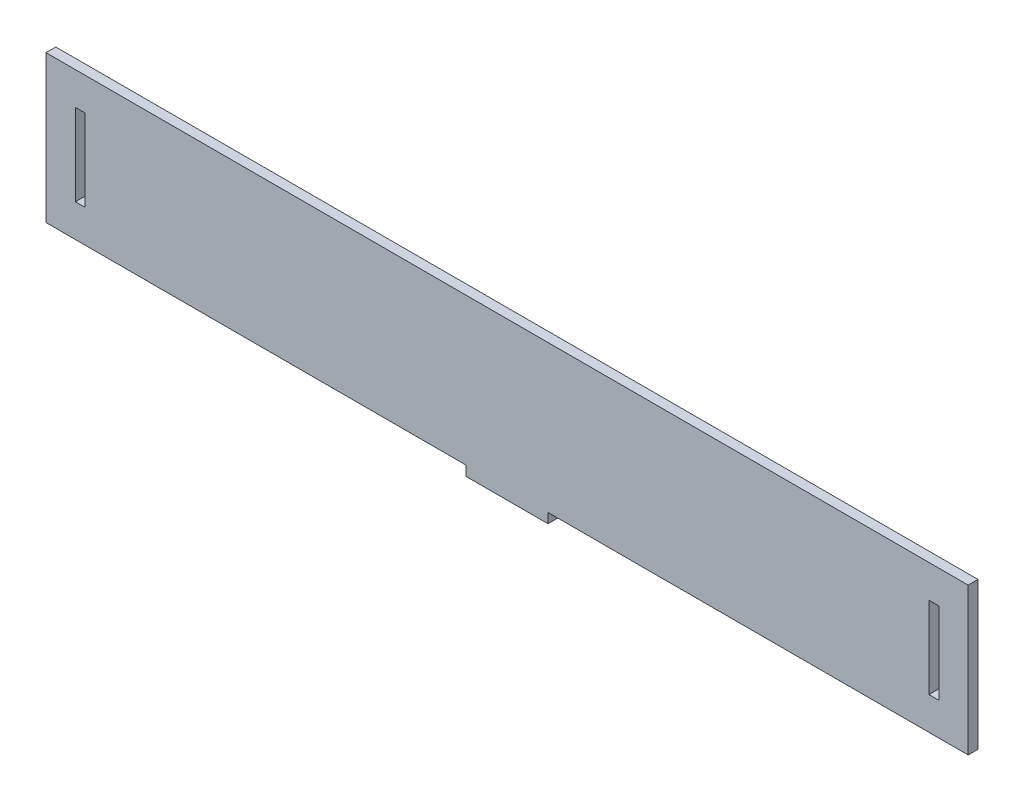
ISO-10303-21;
HEADER;
FILE_DESCRIPTION(('STEP AP214'),'2;1');
FILE_NAME('part.step','',(''),(''),'','','');
FILE_SCHEMA(('AUTOMOTIVE_DESIGN { 1 0 10303 214 1 1 1 1 }'));
ENDSEC;
DATA;
#1=APPLICATION_CONTEXT('core data for automotive mechanical design processes');
#2=APPLICATION_PROTOCOL_DEFINITION('international standard','automotive_design',2000,#1);
#3=PRODUCT_CONTEXT('',#1,'mechanical');
#4=PRODUCT('Part','Part','',(#3));
#5=PRODUCT_RELATED_PRODUCT_CATEGORY('part','',(#4));
#6=PRODUCT_DEFINITION_FORMATION('','',#4);
#7=PRODUCT_DEFINITION_CONTEXT('part definition',#1,'design');
#8=PRODUCT_DEFINITION('design','',#6,#7);
#9=PRODUCT_DEFINITION_SHAPE('','',#8);
#10=(LENGTH_UNIT() NAMED_UNIT(*) SI_UNIT(.MILLI.,.METRE.));
#11=(NAMED_UNIT(*) PLANE_ANGLE_UNIT() SI_UNIT($,.RADIAN.));
#12=(NAMED_UNIT(*) SI_UNIT($,.STERADIAN.) SOLID_ANGLE_UNIT());
#13=UNCERTAINTY_MEASURE_WITH_UNIT(LENGTH_MEASURE(1.E-05),#10,'distance_accuracy_value','');
#14=(GEOMETRIC_REPRESENTATION_CONTEXT(3) GLOBAL_UNCERTAINTY_ASSIGNED_CONTEXT((#13)) GLOBAL_UNIT_ASSIGNED_CONTEXT((#10,
#11,#12)) REPRESENTATION_CONTEXT('',''));
#15=CARTESIAN_POINT('',(0.,0.,0.));
#16=DIRECTION('',(0.,0.,1.));
#17=DIRECTION('',(1.,0.,0.));
#18=AXIS2_PLACEMENT_3D('',#15,#16,#17);
#19=CARTESIAN_POINT('',(0.,0.,6.));
#20=DIRECTION('',(0.,0.,1.));
#21=DIRECTION('',(1.,0.,0.));
#22=AXIS2_PLACEMENT_3D('',#19,#20,#21);
#23=PLANE('',#22);
#24=DIRECTION('',(0.,-1.,0.));
#25=VECTOR('',#24,1.);
#26=CARTESIAN_POINT('',(0.,0.,6.));
#27=LINE('',#26,#25);
#28=CARTESIAN_POINT('',(0.,0.,6.));
#29=VERTEX_POINT('',#28);
#30=CARTESIAN_POINT('',(0.,-90.,6.));
#31=VERTEX_POINT('',#30);
#32=EDGE_CURVE('E215',#29,#31,#27,.T.);
#33=ORIENTED_EDGE('',*,*,#32,.T.);
#34=DIRECTION('',(1.,0.,0.));
#35=VECTOR('',#34,1.);
#36=CARTESIAN_POINT('',(0.,-90.,6.));
#37=LINE('',#36,#35);
#38=CARTESIAN_POINT('',(257.,-90.,6.));
#39=VERTEX_POINT('',#38);
#40=EDGE_CURVE('E218',#31,#39,#37,.T.);
#41=ORIENTED_EDGE('',*,*,#40,.T.);
#42=DIRECTION('',(0.,-1.,0.));
#43=VECTOR('',#42,1.);
#44=CARTESIAN_POINT('',(257.,-90.,6.));
#45=LINE('',#44,#43);
#46=CARTESIAN_POINT('',(257.,-95.9999999999999,6.));
#47=VERTEX_POINT('',#46);
#48=EDGE_CURVE('E221',#39,#47,#45,.T.);
#49=ORIENTED_EDGE('',*,*,#48,.T.);
#50=DIRECTION('',(1.,0.,0.));
#51=VECTOR('',#50,1.);
#52=CARTESIAN_POINT('',(257.,-95.9999999999999,6.));
#53=LINE('',#52,#51);
#54=CARTESIAN_POINT('',(307.,-95.9999999999999,6.));
#55=VERTEX_POINT('',#54);
#56=EDGE_CURVE('E223',#47,#55,#53,.T.);
#57=ORIENTED_EDGE('',*,*,#56,.T.);
#58=DIRECTION('',(0.,1.,0.));
#59=VECTOR('',#58,1.);
#60=CARTESIAN_POINT('',(307.,-90.,6.));
#61=LINE('',#60,#59);
#62=CARTESIAN_POINT('',(307.,-90.,6.));
#63=VERTEX_POINT('',#62);
#64=EDGE_CURVE('E225',#55,#63,#61,.T.);
#65=ORIENTED_EDGE('',*,*,#64,.T.);
#66=DIRECTION('',(1.,0.,0.));
#67=VECTOR('',#66,1.);
#68=CARTESIAN_POINT('',(307.,-90.,6.));
#69=LINE('',#68,#67);
#70=CARTESIAN_POINT('',(564.,-90.,6.));
#71=VERTEX_POINT('',#70);
#72=EDGE_CURVE('E227',#63,#71,#69,.T.);
#73=ORIENTED_EDGE('',*,*,#72,.T.);
#74=DIRECTION('',(0.,1.,0.));
#75=VECTOR('',#74,1.);
#76=CARTESIAN_POINT('',(564.,0.,6.));
#77=LINE('',#76,#75);
#78=CARTESIAN_POINT('',(564.,0.,6.));
#79=VERTEX_POINT('',#78);
#80=EDGE_CURVE('E229',#71,#79,#77,.T.);
#81=ORIENTED_EDGE('',*,*,#80,.T.);
#82=DIRECTION('',(-1.,0.,0.));
#83=VECTOR('',#82,1.);
#84=CARTESIAN_POINT('',(0.,0.,6.));
#85=LINE('',#84,#83);
#86=EDGE_CURVE('E231',#79,#29,#85,.T.);
#87=ORIENTED_EDGE('',*,*,#86,.T.);
#88=EDGE_LOOP('',(#33,#41,#49,#57,#65,#73,#81,#87));
#89=FACE_BOUND('',#88,.T.);
#90=DIRECTION('',(-1.,0.,0.));
#91=VECTOR('',#90,1.);
#92=CARTESIAN_POINT('',(18.,-20.,6.));
#93=LINE('',#92,#91);
#94=CARTESIAN_POINT('',(24.,-20.,6.));
#95=VERTEX_POINT('',#94);
#96=CARTESIAN_POINT('',(18.,-20.,6.));
#97=VERTEX_POINT('',#96);
#98=EDGE_CURVE('E186',#95,#97,#93,.T.);
#99=ORIENTED_EDGE('',*,*,#98,.F.);
#100=DIRECTION('',(0.,1.,0.));
#101=VECTOR('',#100,1.);
#102=CARTESIAN_POINT('',(24.,-20.,6.));
#103=LINE('',#102,#101);
#104=CARTESIAN_POINT('',(24.,-70.,6.));
#105=VERTEX_POINT('',#104);
#106=EDGE_CURVE('E184',#105,#95,#103,.T.);
#107=ORIENTED_EDGE('',*,*,#106,.F.);
#108=DIRECTION('',(1.,0.,0.));
#109=VECTOR('',#108,1.);
#110=CARTESIAN_POINT('',(18.,-70.,6.));
#111=LINE('',#110,#109);
#112=CARTESIAN_POINT('',(18.,-70.,6.));
#113=VERTEX_POINT('',#112);
#114=EDGE_CURVE('E192',#113,#105,#111,.T.);
#115=ORIENTED_EDGE('',*,*,#114,.F.);
#116=DIRECTION('',(0.,-1.,0.));
#117=VECTOR('',#116,1.);
#118=CARTESIAN_POINT('',(18.,-20.,6.));
#119=LINE('',#118,#117);
#120=EDGE_CURVE('E189',#97,#113,#119,.T.);
#121=ORIENTED_EDGE('',*,*,#120,.F.);
#122=EDGE_LOOP('',(#99,#107,#115,#121));
#123=FACE_BOUND('',#122,.T.);
#124=DIRECTION('',(-1.,0.,0.));
#125=VECTOR('',#124,1.);
#126=CARTESIAN_POINT('',(546.,-20.,6.));
#127=LINE('',#126,#125);
#128=CARTESIAN_POINT('',(546.,-20.,6.));
#129=VERTEX_POINT('',#128);
#130=CARTESIAN_POINT('',(540.,-20.,6.));
#131=VERTEX_POINT('',#130);
#132=EDGE_CURVE('E156',#129,#131,#127,.T.);
#133=ORIENTED_EDGE('',*,*,#132,.F.);
#134=DIRECTION('',(0.,1.,0.));
#135=VECTOR('',#134,1.);
#136=CARTESIAN_POINT('',(546.,-20.,6.));
#137=LINE('',#136,#135);
#138=CARTESIAN_POINT('',(546.,-70.,6.));
#139=VERTEX_POINT('',#138);
#140=EDGE_CURVE('E148',#139,#129,#137,.T.);
#141=ORIENTED_EDGE('',*,*,#140,.F.);
#142=DIRECTION('',(1.,0.,0.));
#143=VECTOR('',#142,1.);
#144=CARTESIAN_POINT('',(546.,-70.,6.));
#145=LINE('',#144,#143);
#146=CARTESIAN_POINT('',(540.,-70.,6.));
#147=VERTEX_POINT('',#146);
#148=EDGE_CURVE('E170',#147,#139,#145,.T.);
#149=ORIENTED_EDGE('',*,*,#148,.F.);
#150=DIRECTION('',(0.,-1.,0.));
#151=VECTOR('',#150,1.);
#152=CARTESIAN_POINT('',(540.,-20.,6.));
#153=LINE('',#152,#151);
#154=EDGE_CURVE('E168',#131,#147,#153,.T.);
#155=ORIENTED_EDGE('',*,*,#154,.F.);
#156=EDGE_LOOP('',(#133,#141,#149,#155));
#157=FACE_BOUND('',#156,.T.);
#158=ADVANCED_FACE('F35',(#89,#123,#157),#23,.T.);
#159=CARTESIAN_POINT('',(0.,0.,0.));
#160=DIRECTION('',(0.,0.,1.));
#161=DIRECTION('',(1.,0.,0.));
#162=AXIS2_PLACEMENT_3D('',#159,#160,#161);
#163=PLANE('',#162);
#164=DIRECTION('',(0.,1.,0.));
#165=VECTOR('',#164,1.);
#166=CARTESIAN_POINT('',(24.,-20.,0.));
#167=LINE('',#166,#165);
#168=CARTESIAN_POINT('',(24.,-70.,0.));
#169=VERTEX_POINT('',#168);
#170=CARTESIAN_POINT('',(24.,-20.,0.));
#171=VERTEX_POINT('',#170);
#172=EDGE_CURVE('E164',#169,#171,#167,.T.);
#173=ORIENTED_EDGE('',*,*,#172,.T.);
#174=DIRECTION('',(-1.,0.,0.));
#175=VECTOR('',#174,1.);
#176=CARTESIAN_POINT('',(18.,-20.,0.));
#177=LINE('',#176,#175);
#178=CARTESIAN_POINT('',(18.,-20.,0.));
#179=VERTEX_POINT('',#178);
#180=EDGE_CURVE('E197',#171,#179,#177,.T.);
#181=ORIENTED_EDGE('',*,*,#180,.T.);
#182=DIRECTION('',(0.,-1.,0.));
#183=VECTOR('',#182,1.);
#184=CARTESIAN_POINT('',(18.,-20.,0.));
#185=LINE('',#184,#183);
#186=CARTESIAN_POINT('',(18.,-70.,0.));
#187=VERTEX_POINT('',#186);
#188=EDGE_CURVE('E200',#179,#187,#185,.T.);
#189=ORIENTED_EDGE('',*,*,#188,.T.);
#190=DIRECTION('',(1.,0.,0.));
#191=VECTOR('',#190,1.);
#192=CARTESIAN_POINT('',(18.,-70.,0.));
#193=LINE('',#192,#191);
#194=EDGE_CURVE('E187',#187,#169,#193,.T.);
#195=ORIENTED_EDGE('',*,*,#194,.T.);
#196=EDGE_LOOP('',(#173,#181,#189,#195));
#197=FACE_BOUND('',#196,.T.);
#198=DIRECTION('',(0.,-1.,0.));
#199=VECTOR('',#198,1.);
#200=CARTESIAN_POINT('',(0.,0.,0.));
#201=LINE('',#200,#199);
#202=CARTESIAN_POINT('',(0.,0.,0.));
#203=VERTEX_POINT('',#202);
#204=CARTESIAN_POINT('',(0.,-90.,0.));
#205=VERTEX_POINT('',#204);
#206=EDGE_CURVE('E214',#203,#205,#201,.T.);
#207=ORIENTED_EDGE('',*,*,#206,.F.);
#208=DIRECTION('',(-1.,0.,0.));
#209=VECTOR('',#208,1.);
#210=CARTESIAN_POINT('',(0.,0.,0.));
#211=LINE('',#210,#209);
#212=CARTESIAN_POINT('',(564.,0.,0.));
#213=VERTEX_POINT('',#212);
#214=EDGE_CURVE('E219',#213,#203,#211,.T.);
#215=ORIENTED_EDGE('',*,*,#214,.F.);
#216=DIRECTION('',(0.,1.,0.));
#217=VECTOR('',#216,1.);
#218=CARTESIAN_POINT('',(564.,0.,0.));
#219=LINE('',#218,#217);
#220=CARTESIAN_POINT('',(564.,-90.,0.));
#221=VERTEX_POINT('',#220);
#222=EDGE_CURVE('E246',#221,#213,#219,.T.);
#223=ORIENTED_EDGE('',*,*,#222,.F.);
#224=DIRECTION('',(1.,0.,0.));
#225=VECTOR('',#224,1.);
#226=CARTESIAN_POINT('',(307.,-90.,0.));
#227=LINE('',#226,#225);
#228=CARTESIAN_POINT('',(307.,-90.,0.));
#229=VERTEX_POINT('',#228);
#230=EDGE_CURVE('E244',#229,#221,#227,.T.);
#231=ORIENTED_EDGE('',*,*,#230,.F.);
#232=DIRECTION('',(0.,1.,0.));
#233=VECTOR('',#232,1.);
#234=CARTESIAN_POINT('',(307.,-90.,0.));
#235=LINE('',#234,#233);
#236=CARTESIAN_POINT('',(307.,-95.9999999999999,0.));
#237=VERTEX_POINT('',#236);
#238=EDGE_CURVE('E242',#237,#229,#235,.T.);
#239=ORIENTED_EDGE('',*,*,#238,.F.);
#240=DIRECTION('',(1.,0.,0.));
#241=VECTOR('',#240,1.);
#242=CARTESIAN_POINT('',(257.,-95.9999999999999,0.));
#243=LINE('',#242,#241);
#244=CARTESIAN_POINT('',(257.,-95.9999999999999,0.));
#245=VERTEX_POINT('',#244);
#246=EDGE_CURVE('E240',#245,#237,#243,.T.);
#247=ORIENTED_EDGE('',*,*,#246,.F.);
#248=DIRECTION('',(0.,-1.,0.));
#249=VECTOR('',#248,1.);
#250=CARTESIAN_POINT('',(257.,-90.,0.));
#251=LINE('',#250,#249);
#252=CARTESIAN_POINT('',(257.,-90.,0.));
#253=VERTEX_POINT('',#252);
#254=EDGE_CURVE('E238',#253,#245,#251,.T.);
#255=ORIENTED_EDGE('',*,*,#254,.F.);
#256=DIRECTION('',(1.,0.,0.));
#257=VECTOR('',#256,1.);
#258=CARTESIAN_POINT('',(0.,-90.,0.));
#259=LINE('',#258,#257);
#260=EDGE_CURVE('E236',#205,#253,#259,.T.);
#261=ORIENTED_EDGE('',*,*,#260,.F.);
#262=EDGE_LOOP('',(#207,#215,#223,#231,#239,#247,#255,#261));
#263=FACE_BOUND('',#262,.T.);
#264=DIRECTION('',(0.,1.,0.));
#265=VECTOR('',#264,1.);
#266=CARTESIAN_POINT('',(546.,-20.,0.));
#267=LINE('',#266,#265);
#268=CARTESIAN_POINT('',(546.,-70.,0.));
#269=VERTEX_POINT('',#268);
#270=CARTESIAN_POINT('',(546.,-20.,0.));
#271=VERTEX_POINT('',#270);
#272=EDGE_CURVE('E58',#269,#271,#267,.T.);
#273=ORIENTED_EDGE('',*,*,#272,.T.);
#274=DIRECTION('',(-1.,0.,0.));
#275=VECTOR('',#274,1.);
#276=CARTESIAN_POINT('',(546.,-20.,0.));
#277=LINE('',#276,#275);
#278=CARTESIAN_POINT('',(540.,-20.,0.));
#279=VERTEX_POINT('',#278);
#280=EDGE_CURVE('E163',#271,#279,#277,.T.);
#281=ORIENTED_EDGE('',*,*,#280,.T.);
#282=DIRECTION('',(0.,-1.,0.));
#283=VECTOR('',#282,1.);
#284=CARTESIAN_POINT('',(540.,-20.,0.));
#285=LINE('',#284,#283);
#286=CARTESIAN_POINT('',(540.,-70.,0.));
#287=VERTEX_POINT('',#286);
#288=EDGE_CURVE('E176',#279,#287,#285,.T.);
#289=ORIENTED_EDGE('',*,*,#288,.T.);
#290=DIRECTION('',(1.,0.,0.));
#291=VECTOR('',#290,1.);
#292=CARTESIAN_POINT('',(546.,-70.,0.));
#293=LINE('',#292,#291);
#294=EDGE_CURVE('E157',#287,#269,#293,.T.);
#295=ORIENTED_EDGE('',*,*,#294,.T.);
#296=EDGE_LOOP('',(#273,#281,#289,#295));
#297=FACE_BOUND('',#296,.T.);
#298=ADVANCED_FACE('F276',(#197,#263,#297),#163,.F.);
#299=CARTESIAN_POINT('',(0.,0.,6.));
#300=DIRECTION('',(1.,0.,0.));
#301=DIRECTION('',(0.,1.,0.));
#302=AXIS2_PLACEMENT_3D('',#299,#300,#301);
#303=PLANE('',#302);
#304=ORIENTED_EDGE('',*,*,#206,.T.);
#305=DIRECTION('',(0.,0.,-1.));
#306=VECTOR('',#305,1.);
#307=CARTESIAN_POINT('',(0.,-90.,6.));
#308=LINE('',#307,#306);
#309=EDGE_CURVE('E11',#31,#205,#308,.T.);
#310=ORIENTED_EDGE('',*,*,#309,.F.);
#311=ORIENTED_EDGE('',*,*,#32,.F.);
#312=DIRECTION('',(0.,0.,-1.));
#313=VECTOR('',#312,1.);
#314=CARTESIAN_POINT('',(0.,0.,6.));
#315=LINE('',#314,#313);
#316=EDGE_CURVE('E233',#29,#203,#315,.T.);
#317=ORIENTED_EDGE('',*,*,#316,.T.);
#318=EDGE_LOOP('',(#304,#310,#311,#317));
#319=FACE_BOUND('',#318,.T.);
#320=ADVANCED_FACE('F37',(#319),#303,.F.);
#321=CARTESIAN_POINT('',(0.,-90.,6.));
#322=DIRECTION('',(0.,1.,0.));
#323=DIRECTION('',(0.,0.,1.));
#324=AXIS2_PLACEMENT_3D('',#321,#322,#323);
#325=PLANE('',#324);
#326=ORIENTED_EDGE('',*,*,#260,.T.);
#327=DIRECTION('',(0.,0.,-1.));
#328=VECTOR('',#327,1.);
#329=CARTESIAN_POINT('',(257.,-90.,6.));
#330=LINE('',#329,#328);
#331=EDGE_CURVE('E43',#39,#253,#330,.T.);
#332=ORIENTED_EDGE('',*,*,#331,.F.);
#333=ORIENTED_EDGE('',*,*,#40,.F.);
#334=ORIENTED_EDGE('',*,*,#309,.T.);
#335=EDGE_LOOP('',(#326,#332,#333,#334));
#336=FACE_BOUND('',#335,.T.);
#337=ADVANCED_FACE('F294',(#336),#325,.F.);
#338=CARTESIAN_POINT('',(257.,-90.,6.));
#339=DIRECTION('',(1.,0.,0.));
#340=DIRECTION('',(0.,0.,-1.));
#341=AXIS2_PLACEMENT_3D('',#338,#339,#340);
#342=PLANE('',#341);
#343=ORIENTED_EDGE('',*,*,#254,.T.);
#344=DIRECTION('',(0.,0.,-1.));
#345=VECTOR('',#344,1.);
#346=CARTESIAN_POINT('',(257.,-95.9999999999999,6.));
#347=LINE('',#346,#345);
#348=EDGE_CURVE('E263',#47,#245,#347,.T.);
#349=ORIENTED_EDGE('',*,*,#348,.F.);
#350=ORIENTED_EDGE('',*,*,#48,.F.);
#351=ORIENTED_EDGE('',*,*,#331,.T.);
#352=EDGE_LOOP('',(#343,#349,#350,#351));
#353=FACE_BOUND('',#352,.T.);
#354=ADVANCED_FACE('F270',(#353),#342,.F.);
#355=CARTESIAN_POINT('',(257.,-95.9999999999999,6.));
#356=DIRECTION('',(0.,1.,0.));
#357=DIRECTION('',(0.,0.,1.));
#358=AXIS2_PLACEMENT_3D('',#355,#356,#357);
#359=PLANE('',#358);
#360=ORIENTED_EDGE('',*,*,#246,.T.);
#361=DIRECTION('',(0.,0.,-1.));
#362=VECTOR('',#361,1.);
#363=CARTESIAN_POINT('',(307.,-95.9999999999999,6.));
#364=LINE('',#363,#362);
#365=EDGE_CURVE('E260',#55,#237,#364,.T.);
#366=ORIENTED_EDGE('',*,*,#365,.F.);
#367=ORIENTED_EDGE('',*,*,#56,.F.);
#368=ORIENTED_EDGE('',*,*,#348,.T.);
#369=EDGE_LOOP('',(#360,#366,#367,#368));
#370=FACE_BOUND('',#369,.T.);
#371=ADVANCED_FACE('F282',(#370),#359,.F.);
#372=CARTESIAN_POINT('',(307.,-90.,6.));
#373=DIRECTION('',(-1.,0.,0.));
#374=DIRECTION('',(0.,0.,1.));
#375=AXIS2_PLACEMENT_3D('',#372,#373,#374);
#376=PLANE('',#375);
#377=ORIENTED_EDGE('',*,*,#238,.T.);
#378=DIRECTION('',(0.,0.,-1.));
#379=VECTOR('',#378,1.);
#380=CARTESIAN_POINT('',(307.,-90.,6.));
#381=LINE('',#380,#379);
#382=EDGE_CURVE('E257',#63,#229,#381,.T.);
#383=ORIENTED_EDGE('',*,*,#382,.F.);
#384=ORIENTED_EDGE('',*,*,#64,.F.);
#385=ORIENTED_EDGE('',*,*,#365,.T.);
#386=EDGE_LOOP('',(#377,#383,#384,#385));
#387=FACE_BOUND('',#386,.T.);
#388=ADVANCED_FACE('F286',(#387),#376,.F.);
#389=CARTESIAN_POINT('',(307.,-90.,6.));
#390=DIRECTION('',(0.,1.,0.));
#391=DIRECTION('',(0.,0.,1.));
#392=AXIS2_PLACEMENT_3D('',#389,#390,#391);
#393=PLANE('',#392);
#394=ORIENTED_EDGE('',*,*,#230,.T.);
#395=DIRECTION('',(0.,0.,-1.));
#396=VECTOR('',#395,1.);
#397=CARTESIAN_POINT('',(564.,-90.,6.));
#398=LINE('',#397,#396);
#399=EDGE_CURVE('E254',#71,#221,#398,.T.);
#400=ORIENTED_EDGE('',*,*,#399,.F.);
#401=ORIENTED_EDGE('',*,*,#72,.F.);
#402=ORIENTED_EDGE('',*,*,#382,.T.);
#403=EDGE_LOOP('',(#394,#400,#401,#402));
#404=FACE_BOUND('',#403,.T.);
#405=ADVANCED_FACE('F307',(#404),#393,.F.);
#406=CARTESIAN_POINT('',(564.,0.,6.));
#407=DIRECTION('',(-1.,0.,0.));
#408=DIRECTION('',(0.,0.,1.));
#409=AXIS2_PLACEMENT_3D('',#406,#407,#408);
#410=PLANE('',#409);
#411=ORIENTED_EDGE('',*,*,#222,.T.);
#412=DIRECTION('',(0.,0.,-1.));
#413=VECTOR('',#412,1.);
#414=CARTESIAN_POINT('',(564.,0.,6.));
#415=LINE('',#414,#413);
#416=EDGE_CURVE('E251',#79,#213,#415,.T.);
#417=ORIENTED_EDGE('',*,*,#416,.F.);
#418=ORIENTED_EDGE('',*,*,#80,.F.);
#419=ORIENTED_EDGE('',*,*,#399,.T.);
#420=EDGE_LOOP('',(#411,#417,#418,#419));
#421=FACE_BOUND('',#420,.T.);
#422=ADVANCED_FACE('F305',(#421),#410,.F.);
#423=CARTESIAN_POINT('',(0.,0.,6.));
#424=DIRECTION('',(0.,-1.,0.));
#425=DIRECTION('',(0.,0.,-1.));
#426=AXIS2_PLACEMENT_3D('',#423,#424,#425);
#427=PLANE('',#426);
#428=ORIENTED_EDGE('',*,*,#214,.T.);
#429=ORIENTED_EDGE('',*,*,#316,.F.);
#430=ORIENTED_EDGE('',*,*,#86,.F.);
#431=ORIENTED_EDGE('',*,*,#416,.T.);
#432=EDGE_LOOP('',(#428,#429,#430,#431));
#433=FACE_BOUND('',#432,.T.);
#434=ADVANCED_FACE('F300',(#433),#427,.F.);
#435=CARTESIAN_POINT('',(24.,-20.,6.));
#436=DIRECTION('',(-1.,0.,0.));
#437=DIRECTION('',(0.,-1.,0.));
#438=AXIS2_PLACEMENT_3D('',#435,#436,#437);
#439=PLANE('',#438);
#440=ORIENTED_EDGE('',*,*,#172,.F.);
#441=DIRECTION('',(0.,0.,-1.));
#442=VECTOR('',#441,1.);
#443=CARTESIAN_POINT('',(24.,-70.,6.));
#444=LINE('',#443,#442);
#445=EDGE_CURVE('E194',#105,#169,#444,.T.);
#446=ORIENTED_EDGE('',*,*,#445,.F.);
#447=ORIENTED_EDGE('',*,*,#106,.T.);
#448=DIRECTION('',(0.,0.,-1.));
#449=VECTOR('',#448,1.);
#450=CARTESIAN_POINT('',(24.,-20.,6.));
#451=LINE('',#450,#449);
#452=EDGE_CURVE('E211',#95,#171,#451,.T.);
#453=ORIENTED_EDGE('',*,*,#452,.T.);
#454=EDGE_LOOP('',(#440,#446,#447,#453));
#455=FACE_BOUND('',#454,.T.);
#456=ADVANCED_FACE('F324',(#455),#439,.T.);
#457=CARTESIAN_POINT('',(18.,-20.,6.));
#458=DIRECTION('',(0.,-1.,0.));
#459=DIRECTION('',(0.,0.,-1.));
#460=AXIS2_PLACEMENT_3D('',#457,#458,#459);
#461=PLANE('',#460);
#462=ORIENTED_EDGE('',*,*,#180,.F.);
#463=ORIENTED_EDGE('',*,*,#452,.F.);
#464=ORIENTED_EDGE('',*,*,#98,.T.);
#465=DIRECTION('',(0.,0.,-1.));
#466=VECTOR('',#465,1.);
#467=CARTESIAN_POINT('',(18.,-20.,6.));
#468=LINE('',#467,#466);
#469=EDGE_CURVE('E209',#97,#179,#468,.T.);
#470=ORIENTED_EDGE('',*,*,#469,.T.);
#471=EDGE_LOOP('',(#462,#463,#464,#470));
#472=FACE_BOUND('',#471,.T.);
#473=ADVANCED_FACE('F331',(#472),#461,.T.);
#474=CARTESIAN_POINT('',(18.,-20.,6.));
#475=DIRECTION('',(1.,0.,0.));
#476=DIRECTION('',(0.,1.,0.));
#477=AXIS2_PLACEMENT_3D('',#474,#475,#476);
#478=PLANE('',#477);
#479=ORIENTED_EDGE('',*,*,#188,.F.);
#480=ORIENTED_EDGE('',*,*,#469,.F.);
#481=ORIENTED_EDGE('',*,*,#120,.T.);
#482=DIRECTION('',(0.,0.,-1.));
#483=VECTOR('',#482,1.);
#484=CARTESIAN_POINT('',(18.,-70.,6.));
#485=LINE('',#484,#483);
#486=EDGE_CURVE('E207',#113,#187,#485,.T.);
#487=ORIENTED_EDGE('',*,*,#486,.T.);
#488=EDGE_LOOP('',(#479,#480,#481,#487));
#489=FACE_BOUND('',#488,.T.);
#490=ADVANCED_FACE('F336',(#489),#478,.T.);
#491=CARTESIAN_POINT('',(18.,-70.,6.));
#492=DIRECTION('',(0.,1.,0.));
#493=DIRECTION('',(0.,0.,1.));
#494=AXIS2_PLACEMENT_3D('',#491,#492,#493);
#495=PLANE('',#494);
#496=ORIENTED_EDGE('',*,*,#194,.F.);
#497=ORIENTED_EDGE('',*,*,#486,.F.);
#498=ORIENTED_EDGE('',*,*,#114,.T.);
#499=ORIENTED_EDGE('',*,*,#445,.T.);
#500=EDGE_LOOP('',(#496,#497,#498,#499));
#501=FACE_BOUND('',#500,.T.);
#502=ADVANCED_FACE('F343',(#501),#495,.T.);
#503=CARTESIAN_POINT('',(546.,-20.,6.));
#504=DIRECTION('',(-1.,0.,0.));
#505=DIRECTION('',(0.,0.,1.));
#506=AXIS2_PLACEMENT_3D('',#503,#504,#505);
#507=PLANE('',#506);
#508=ORIENTED_EDGE('',*,*,#272,.F.);
#509=DIRECTION('',(0.,0.,-1.));
#510=VECTOR('',#509,1.);
#511=CARTESIAN_POINT('',(546.,-70.,6.));
#512=LINE('',#511,#510);
#513=EDGE_CURVE('E152',#139,#269,#512,.T.);
#514=ORIENTED_EDGE('',*,*,#513,.F.);
#515=ORIENTED_EDGE('',*,*,#140,.T.);
#516=DIRECTION('',(0.,0.,-1.));
#517=VECTOR('',#516,1.);
#518=CARTESIAN_POINT('',(546.,-20.,6.));
#519=LINE('',#518,#517);
#520=EDGE_CURVE('E151',#129,#271,#519,.T.);
#521=ORIENTED_EDGE('',*,*,#520,.T.);
#522=EDGE_LOOP('',(#508,#514,#515,#521));
#523=FACE_BOUND('',#522,.T.);
#524=ADVANCED_FACE('F150',(#523),#507,.T.);
#525=CARTESIAN_POINT('',(546.,-20.,6.));
#526=DIRECTION('',(0.,-1.,0.));
#527=DIRECTION('',(1.,0.,0.));
#528=AXIS2_PLACEMENT_3D('',#525,#526,#527);
#529=PLANE('',#528);
#530=ORIENTED_EDGE('',*,*,#280,.F.);
#531=ORIENTED_EDGE('',*,*,#520,.F.);
#532=ORIENTED_EDGE('',*,*,#132,.T.);
#533=DIRECTION('',(0.,0.,-1.));
#534=VECTOR('',#533,1.);
#535=CARTESIAN_POINT('',(540.,-20.,6.));
#536=LINE('',#535,#534);
#537=EDGE_CURVE('E165',#131,#279,#536,.T.);
#538=ORIENTED_EDGE('',*,*,#537,.T.);
#539=EDGE_LOOP('',(#530,#531,#532,#538));
#540=FACE_BOUND('',#539,.T.);
#541=ADVANCED_FACE('F160',(#540),#529,.T.);
#542=CARTESIAN_POINT('',(540.,-20.,6.));
#543=DIRECTION('',(1.,0.,0.));
#544=DIRECTION('',(0.,0.,-1.));
#545=AXIS2_PLACEMENT_3D('',#542,#543,#544);
#546=PLANE('',#545);
#547=ORIENTED_EDGE('',*,*,#288,.F.);
#548=ORIENTED_EDGE('',*,*,#537,.F.);
#549=ORIENTED_EDGE('',*,*,#154,.T.);
#550=DIRECTION('',(0.,0.,-1.));
#551=VECTOR('',#550,1.);
#552=CARTESIAN_POINT('',(540.,-70.,6.));
#553=LINE('',#552,#551);
#554=EDGE_CURVE('E50',#147,#287,#553,.T.);
#555=ORIENTED_EDGE('',*,*,#554,.T.);
#556=EDGE_LOOP('',(#547,#548,#549,#555));
#557=FACE_BOUND('',#556,.T.);
#558=ADVANCED_FACE('F361',(#557),#546,.T.);
#559=CARTESIAN_POINT('',(546.,-70.,6.));
#560=DIRECTION('',(0.,1.,0.));
#561=DIRECTION('',(-1.,0.,0.));
#562=AXIS2_PLACEMENT_3D('',#559,#560,#561);
#563=PLANE('',#562);
#564=ORIENTED_EDGE('',*,*,#294,.F.);
#565=ORIENTED_EDGE('',*,*,#554,.F.);
#566=ORIENTED_EDGE('',*,*,#148,.T.);
#567=ORIENTED_EDGE('',*,*,#513,.T.);
#568=EDGE_LOOP('',(#564,#565,#566,#567));
#569=FACE_BOUND('',#568,.T.);
#570=ADVANCED_FACE('F364',(#569),#563,.T.);
#571=CLOSED_SHELL('',(#158,#298,#320,#337,#354,#371,#388,#405,#422,#434,#456,#473,#490,#502,
#524,#541,#558,#570));
#572=MANIFOLD_SOLID_BREP('B2',#571);
#573=ADVANCED_BREP_SHAPE_REPRESENTATION('',(#18,#572),#14);
#574=SHAPE_DEFINITION_REPRESENTATION(#9,#573);
ENDSEC;
END-ISO-10303-21;
